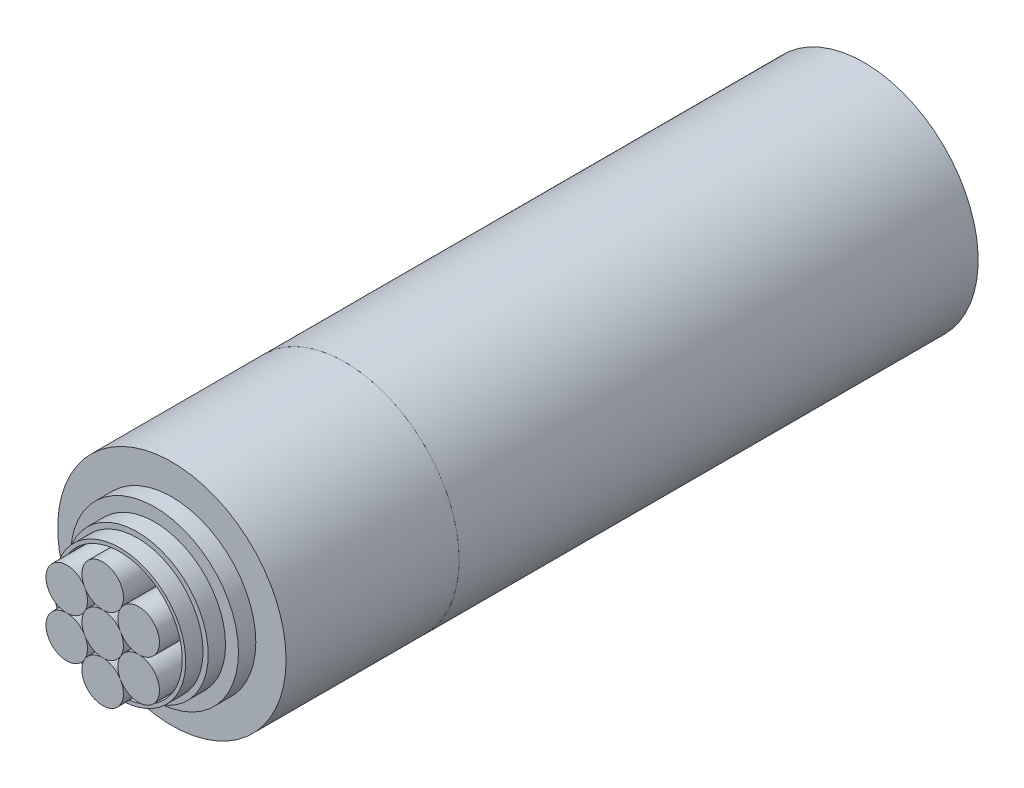
ISO-10303-21;
HEADER;
FILE_DESCRIPTION(('STEP AP214'),'2;1');
FILE_NAME('part.step','',(''),(''),'','','');
FILE_SCHEMA(('AUTOMOTIVE_DESIGN { 1 0 10303 214 1 1 1 1 }'));
ENDSEC;
DATA;
#1=APPLICATION_CONTEXT('core data for automotive mechanical design processes');
#2=APPLICATION_PROTOCOL_DEFINITION('international standard','automotive_design',2000,#1);
#3=PRODUCT_CONTEXT('',#1,'mechanical');
#4=PRODUCT('Part','Part','',(#3));
#5=PRODUCT_RELATED_PRODUCT_CATEGORY('part','',(#4));
#6=PRODUCT_DEFINITION_FORMATION('','',#4);
#7=PRODUCT_DEFINITION_CONTEXT('part definition',#1,'design');
#8=PRODUCT_DEFINITION('design','',#6,#7);
#9=PRODUCT_DEFINITION_SHAPE('','',#8);
#10=(LENGTH_UNIT() NAMED_UNIT(*) SI_UNIT(.MILLI.,.METRE.));
#11=(NAMED_UNIT(*) PLANE_ANGLE_UNIT() SI_UNIT($,.RADIAN.));
#12=(NAMED_UNIT(*) SI_UNIT($,.STERADIAN.) SOLID_ANGLE_UNIT());
#13=UNCERTAINTY_MEASURE_WITH_UNIT(LENGTH_MEASURE(1.E-05),#10,'distance_accuracy_value','');
#14=(GEOMETRIC_REPRESENTATION_CONTEXT(3) GLOBAL_UNCERTAINTY_ASSIGNED_CONTEXT((#13)) GLOBAL_UNIT_ASSIGNED_CONTEXT((#10,
#11,#12)) REPRESENTATION_CONTEXT('',''));
#15=CARTESIAN_POINT('',(0.,0.,0.));
#16=DIRECTION('',(0.,0.,1.));
#17=DIRECTION('',(1.,0.,0.));
#18=AXIS2_PLACEMENT_3D('',#15,#16,#17);
#19=CARTESIAN_POINT('',(0.,0.,-15.));
#20=DIRECTION('',(0.,0.,1.));
#21=DIRECTION('',(1.,0.,0.));
#22=AXIS2_PLACEMENT_3D('',#19,#20,#21);
#23=CYLINDRICAL_SURFACE('',#22,3.3);
#24=CARTESIAN_POINT('',(0.,0.,-15.));
#25=DIRECTION('',(0.,0.,-1.));
#26=DIRECTION('',(-1.,0.,0.));
#27=AXIS2_PLACEMENT_3D('',#24,#25,#26);
#28=CIRCLE('',#27,3.3);
#29=CARTESIAN_POINT('',(-3.3,0.,-15.));
#30=VERTEX_POINT('',#29);
#31=EDGE_CURVE('E12',#30,#30,#28,.T.);
#32=ORIENTED_EDGE('',*,*,#31,.F.);
#33=EDGE_LOOP('',(#32));
#34=FACE_BOUND('',#33,.T.);
#35=CARTESIAN_POINT('',(0.,0.,0.));
#36=DIRECTION('',(0.,0.,-1.));
#37=DIRECTION('',(-1.,0.,0.));
#38=AXIS2_PLACEMENT_3D('',#35,#36,#37);
#39=CIRCLE('',#38,3.3);
#40=CARTESIAN_POINT('',(-3.3,0.,0.));
#41=VERTEX_POINT('',#40);
#42=EDGE_CURVE('E125',#41,#41,#39,.T.);
#43=ORIENTED_EDGE('',*,*,#42,.T.);
#44=EDGE_LOOP('',(#43));
#45=FACE_BOUND('',#44,.T.);
#46=ADVANCED_FACE('F122',(#34,#45),#23,.T.);
#47=CARTESIAN_POINT('',(0.,0.,-15.));
#48=DIRECTION('',(0.,0.,-1.));
#49=DIRECTION('',(-1.,0.,0.));
#50=AXIS2_PLACEMENT_3D('',#47,#48,#49);
#51=PLANE('',#50);
#52=ORIENTED_EDGE('',*,*,#31,.T.);
#53=EDGE_LOOP('',(#52));
#54=FACE_BOUND('',#53,.T.);
#55=ADVANCED_FACE('F139',(#54),#51,.T.);
#56=CARTESIAN_POINT('',(0.,0.,0.));
#57=DIRECTION('',(0.,0.,-1.));
#58=DIRECTION('',(-1.,0.,0.));
#59=AXIS2_PLACEMENT_3D('',#56,#57,#58);
#60=PLANE('',#59);
#61=ORIENTED_EDGE('',*,*,#42,.F.);
#62=EDGE_LOOP('',(#61));
#63=FACE_BOUND('',#62,.T.);
#64=ADVANCED_FACE('F137',(#63),#60,.F.);
#65=CLOSED_SHELL('',(#46,#55,#64));
#66=MANIFOLD_SOLID_BREP('B2',#65);
#67=CARTESIAN_POINT('',(0.,0.,5.));
#68=DIRECTION('',(0.,0.,-1.));
#69=DIRECTION('',(-1.,0.,0.));
#70=AXIS2_PLACEMENT_3D('',#67,#68,#69);
#71=CYLINDRICAL_SURFACE('',#70,3.3);
#72=CARTESIAN_POINT('',(0.,0.,5.));
#73=DIRECTION('',(0.,0.,1.));
#74=DIRECTION('',(1.,0.,0.));
#75=AXIS2_PLACEMENT_3D('',#72,#73,#74);
#76=CIRCLE('',#75,3.3);
#77=CARTESIAN_POINT('',(3.3,0.,5.));
#78=VERTEX_POINT('',#77);
#79=EDGE_CURVE('E121',#78,#78,#76,.T.);
#80=ORIENTED_EDGE('',*,*,#79,.F.);
#81=EDGE_LOOP('',(#80));
#82=FACE_BOUND('',#81,.T.);
#83=CARTESIAN_POINT('',(0.,0.,0.));
#84=DIRECTION('',(0.,0.,1.));
#85=DIRECTION('',(1.,0.,0.));
#86=AXIS2_PLACEMENT_3D('',#83,#84,#85);
#87=CIRCLE('',#86,3.3);
#88=CARTESIAN_POINT('',(3.3,0.,0.));
#89=VERTEX_POINT('',#88);
#90=EDGE_CURVE('E175',#89,#89,#87,.T.);
#91=ORIENTED_EDGE('',*,*,#90,.T.);
#92=EDGE_LOOP('',(#91));
#93=FACE_BOUND('',#92,.T.);
#94=ADVANCED_FACE('F172',(#82,#93),#71,.T.);
#95=CARTESIAN_POINT('',(0.,0.,5.));
#96=DIRECTION('',(0.,0.,1.));
#97=DIRECTION('',(1.,0.,0.));
#98=AXIS2_PLACEMENT_3D('',#95,#96,#97);
#99=PLANE('',#98);
#100=CARTESIAN_POINT('',(0.,0.,5.));
#101=DIRECTION('',(0.,0.,1.));
#102=DIRECTION('',(1.,0.,0.));
#103=AXIS2_PLACEMENT_3D('',#100,#101,#102);
#104=CIRCLE('',#103,2.42499999999999);
#105=CARTESIAN_POINT('',(2.42499999999999,0.,5.));
#106=VERTEX_POINT('',#105);
#107=EDGE_CURVE('E179',#106,#106,#104,.T.);
#108=ORIENTED_EDGE('',*,*,#107,.F.);
#109=EDGE_LOOP('',(#108));
#110=FACE_BOUND('',#109,.T.);
#111=ORIENTED_EDGE('',*,*,#79,.T.);
#112=EDGE_LOOP('',(#111));
#113=FACE_BOUND('',#112,.T.);
#114=ADVANCED_FACE('F226',(#110,#113),#99,.T.);
#115=CARTESIAN_POINT('',(0.,0.,0.));
#116=DIRECTION('',(0.,0.,1.));
#117=DIRECTION('',(1.,0.,0.));
#118=AXIS2_PLACEMENT_3D('',#115,#116,#117);
#119=PLANE('',#118);
#120=ORIENTED_EDGE('',*,*,#90,.F.);
#121=EDGE_LOOP('',(#120));
#122=FACE_BOUND('',#121,.T.);
#123=CARTESIAN_POINT('',(0.,0.,0.));
#124=DIRECTION('',(0.,0.,1.));
#125=DIRECTION('',(1.,0.,0.));
#126=AXIS2_PLACEMENT_3D('',#123,#124,#125);
#127=CIRCLE('',#126,1.79999999999998);
#128=CARTESIAN_POINT('',(-1.79999999999998,0.,0.));
#129=VERTEX_POINT('',#128);
#130=EDGE_CURVE('E198',#129,#129,#127,.T.);
#131=ORIENTED_EDGE('',*,*,#130,.T.);
#132=EDGE_LOOP('',(#131));
#133=FACE_BOUND('',#132,.T.);
#134=ADVANCED_FACE('F231',(#122,#133),#119,.F.);
#135=CARTESIAN_POINT('',(0.,0.,5.5));
#136=DIRECTION('',(0.,0.,-1.));
#137=DIRECTION('',(-1.,0.,0.));
#138=AXIS2_PLACEMENT_3D('',#135,#136,#137);
#139=CYLINDRICAL_SURFACE('',#138,2.42499999999999);
#140=ORIENTED_EDGE('',*,*,#107,.T.);
#141=EDGE_LOOP('',(#140));
#142=FACE_BOUND('',#141,.T.);
#143=CARTESIAN_POINT('',(0.,0.,5.5));
#144=DIRECTION('',(0.,0.,1.));
#145=DIRECTION('',(1.,0.,0.));
#146=AXIS2_PLACEMENT_3D('',#143,#144,#145);
#147=CIRCLE('',#146,2.42499999999999);
#148=CARTESIAN_POINT('',(2.42499999999999,0.,5.5));
#149=VERTEX_POINT('',#148);
#150=EDGE_CURVE('E185',#149,#149,#147,.T.);
#151=ORIENTED_EDGE('',*,*,#150,.F.);
#152=EDGE_LOOP('',(#151));
#153=FACE_BOUND('',#152,.T.);
#154=ADVANCED_FACE('F240',(#142,#153),#139,.T.);
#155=CARTESIAN_POINT('',(0.,0.,5.5));
#156=DIRECTION('',(0.,0.,1.));
#157=DIRECTION('',(1.,0.,0.));
#158=AXIS2_PLACEMENT_3D('',#155,#156,#157);
#159=PLANE('',#158);
#160=CARTESIAN_POINT('',(0.,0.,5.5));
#161=DIRECTION('',(0.,0.,1.));
#162=DIRECTION('',(1.,0.,0.));
#163=AXIS2_PLACEMENT_3D('',#160,#161,#162);
#164=CIRCLE('',#163,2.04999999999999);
#165=CARTESIAN_POINT('',(2.04999999999999,0.,5.5));
#166=VERTEX_POINT('',#165);
#167=EDGE_CURVE('E188',#166,#166,#164,.T.);
#168=ORIENTED_EDGE('',*,*,#167,.F.);
#169=EDGE_LOOP('',(#168));
#170=FACE_BOUND('',#169,.T.);
#171=ORIENTED_EDGE('',*,*,#150,.T.);
#172=EDGE_LOOP('',(#171));
#173=FACE_BOUND('',#172,.T.);
#174=ADVANCED_FACE('F245',(#170,#173),#159,.T.);
#175=CARTESIAN_POINT('',(0.,0.,6.));
#176=DIRECTION('',(0.,0.,-1.));
#177=DIRECTION('',(-1.,0.,0.));
#178=AXIS2_PLACEMENT_3D('',#175,#176,#177);
#179=CYLINDRICAL_SURFACE('',#178,2.04999999999999);
#180=ORIENTED_EDGE('',*,*,#167,.T.);
#181=EDGE_LOOP('',(#180));
#182=FACE_BOUND('',#181,.T.);
#183=CARTESIAN_POINT('',(0.,0.,6.));
#184=DIRECTION('',(0.,0.,1.));
#185=DIRECTION('',(1.,0.,0.));
#186=AXIS2_PLACEMENT_3D('',#183,#184,#185);
#187=CIRCLE('',#186,2.04999999999999);
#188=CARTESIAN_POINT('',(2.04999999999999,0.,6.));
#189=VERTEX_POINT('',#188);
#190=EDGE_CURVE('E191',#189,#189,#187,.T.);
#191=ORIENTED_EDGE('',*,*,#190,.F.);
#192=EDGE_LOOP('',(#191));
#193=FACE_BOUND('',#192,.T.);
#194=ADVANCED_FACE('F251',(#182,#193),#179,.T.);
#195=CARTESIAN_POINT('',(0.,0.,6.));
#196=DIRECTION('',(0.,0.,1.));
#197=DIRECTION('',(1.,0.,0.));
#198=AXIS2_PLACEMENT_3D('',#195,#196,#197);
#199=PLANE('',#198);
#200=CARTESIAN_POINT('',(0.,0.,6.));
#201=DIRECTION('',(0.,0.,1.));
#202=DIRECTION('',(1.,0.,0.));
#203=AXIS2_PLACEMENT_3D('',#200,#201,#202);
#204=CIRCLE('',#203,1.89999999999999);
#205=CARTESIAN_POINT('',(-1.89999999999999,0.,6.));
#206=VERTEX_POINT('',#205);
#207=EDGE_CURVE('E194',#206,#206,#204,.T.);
#208=ORIENTED_EDGE('',*,*,#207,.F.);
#209=EDGE_LOOP('',(#208));
#210=FACE_BOUND('',#209,.T.);
#211=ORIENTED_EDGE('',*,*,#190,.T.);
#212=EDGE_LOOP('',(#211));
#213=FACE_BOUND('',#212,.T.);
#214=ADVANCED_FACE('F223',(#210,#213),#199,.T.);
#215=CARTESIAN_POINT('',(0.,0.,6.5));
#216=DIRECTION('',(0.,0.,-1.));
#217=DIRECTION('',(-1.,0.,0.));
#218=AXIS2_PLACEMENT_3D('',#215,#216,#217);
#219=CYLINDRICAL_SURFACE('',#218,1.79999999999998);
#220=CARTESIAN_POINT('',(0.,0.,6.5));
#221=DIRECTION('',(0.,0.,1.));
#222=DIRECTION('',(1.,0.,0.));
#223=AXIS2_PLACEMENT_3D('',#220,#221,#222);
#224=CIRCLE('',#223,1.79999999999998);
#225=CARTESIAN_POINT('',(-1.79999999999998,0.,6.5));
#226=VERTEX_POINT('',#225);
#227=EDGE_CURVE('E201',#226,#226,#224,.T.);
#228=CARTESIAN_POINT('',(-1.79999999999998,0.,6.5));
#229=CARTESIAN_POINT('',(-1.79999999999998,0.,6.43229166666667));
#230=CARTESIAN_POINT('',(-1.79999999999998,0.,6.36458333333333));
#231=CARTESIAN_POINT('',(-1.79999999999998,0.,6.22916666666667));
#232=CARTESIAN_POINT('',(-1.79999999999998,0.,6.16145833333333));
#233=CARTESIAN_POINT('',(-1.79999999999998,0.,6.02604166666667));
#234=CARTESIAN_POINT('',(-1.79999999999998,0.,5.95833333333333));
#235=CARTESIAN_POINT('',(-1.79999999999998,0.,5.82291666666667));
#236=CARTESIAN_POINT('',(-1.79999999999998,0.,5.75520833333333));
#237=CARTESIAN_POINT('',(-1.79999999999998,0.,5.61979166666667));
#238=CARTESIAN_POINT('',(-1.79999999999998,0.,5.55208333333333));
#239=CARTESIAN_POINT('',(-1.79999999999998,0.,5.41666666666667));
#240=CARTESIAN_POINT('',(-1.79999999999998,0.,5.34895833333333));
#241=CARTESIAN_POINT('',(-1.79999999999998,0.,5.21354166666667));
#242=CARTESIAN_POINT('',(-1.79999999999998,0.,5.14583333333333));
#243=CARTESIAN_POINT('',(-1.79999999999998,0.,5.01041666666667));
#244=CARTESIAN_POINT('',(-1.79999999999998,0.,4.94270833333333));
#245=CARTESIAN_POINT('',(-1.79999999999998,0.,4.80729166666667));
#246=CARTESIAN_POINT('',(-1.79999999999998,0.,4.73958333333333));
#247=CARTESIAN_POINT('',(-1.79999999999998,0.,4.60416666666667));
#248=CARTESIAN_POINT('',(-1.79999999999998,0.,4.53645833333333));
#249=CARTESIAN_POINT('',(-1.79999999999998,0.,4.40104166666667));
#250=CARTESIAN_POINT('',(-1.79999999999998,0.,4.33333333333333));
#251=CARTESIAN_POINT('',(-1.79999999999998,0.,4.19791666666667));
#252=CARTESIAN_POINT('',(-1.79999999999998,0.,4.13020833333333));
#253=CARTESIAN_POINT('',(-1.79999999999998,0.,3.99479166666667));
#254=CARTESIAN_POINT('',(-1.79999999999998,0.,3.92708333333333));
#255=CARTESIAN_POINT('',(-1.79999999999998,0.,3.79166666666667));
#256=CARTESIAN_POINT('',(-1.79999999999998,0.,3.72395833333333));
#257=CARTESIAN_POINT('',(-1.79999999999998,0.,3.58854166666667));
#258=CARTESIAN_POINT('',(-1.79999999999998,0.,3.52083333333333));
#259=CARTESIAN_POINT('',(-1.79999999999998,0.,3.38541666666667));
#260=CARTESIAN_POINT('',(-1.79999999999998,0.,3.31770833333333));
#261=CARTESIAN_POINT('',(-1.79999999999998,0.,3.18229166666667));
#262=CARTESIAN_POINT('',(-1.79999999999998,0.,3.11458333333333));
#263=CARTESIAN_POINT('',(-1.79999999999998,0.,2.97916666666667));
#264=CARTESIAN_POINT('',(-1.79999999999998,0.,2.91145833333333));
#265=CARTESIAN_POINT('',(-1.79999999999998,0.,2.77604166666667));
#266=CARTESIAN_POINT('',(-1.79999999999998,0.,2.70833333333333));
#267=CARTESIAN_POINT('',(-1.79999999999998,0.,2.57291666666667));
#268=CARTESIAN_POINT('',(-1.79999999999998,0.,2.50520833333333));
#269=CARTESIAN_POINT('',(-1.79999999999998,0.,2.36979166666667));
#270=CARTESIAN_POINT('',(-1.79999999999998,0.,2.30208333333333));
#271=CARTESIAN_POINT('',(-1.79999999999998,0.,2.16666666666667));
#272=CARTESIAN_POINT('',(-1.79999999999998,0.,2.09895833333333));
#273=CARTESIAN_POINT('',(-1.79999999999998,0.,1.96354166666667));
#274=CARTESIAN_POINT('',(-1.79999999999998,0.,1.89583333333333));
#275=CARTESIAN_POINT('',(-1.79999999999998,0.,1.76041666666667));
#276=CARTESIAN_POINT('',(-1.79999999999998,0.,1.69270833333333));
#277=CARTESIAN_POINT('',(-1.79999999999998,0.,1.55729166666667));
#278=CARTESIAN_POINT('',(-1.79999999999998,0.,1.48958333333333));
#279=CARTESIAN_POINT('',(-1.79999999999998,0.,1.35416666666667));
#280=CARTESIAN_POINT('',(-1.79999999999998,0.,1.28645833333333));
#281=CARTESIAN_POINT('',(-1.79999999999998,0.,1.15104166666667));
#282=CARTESIAN_POINT('',(-1.79999999999998,0.,1.08333333333333));
#283=CARTESIAN_POINT('',(-1.79999999999998,0.,0.947916666666667));
#284=CARTESIAN_POINT('',(-1.79999999999998,0.,0.880208333333333));
#285=CARTESIAN_POINT('',(-1.79999999999998,0.,0.744791666666667));
#286=CARTESIAN_POINT('',(-1.79999999999998,0.,0.677083333333333));
#287=CARTESIAN_POINT('',(-1.79999999999998,0.,0.541666666666667));
#288=CARTESIAN_POINT('',(-1.79999999999998,0.,0.473958333333333));
#289=CARTESIAN_POINT('',(-1.79999999999998,0.,0.338541666666667));
#290=CARTESIAN_POINT('',(-1.79999999999998,0.,0.270833333333334));
#291=CARTESIAN_POINT('',(-1.79999999999998,0.,0.135416666666667));
#292=CARTESIAN_POINT('',(-1.79999999999998,0.,0.0677083333333334));
#293=CARTESIAN_POINT('',(-1.79999999999998,0.,0.));
#294=B_SPLINE_CURVE_WITH_KNOTS('',3,(#228,#229,#230,#231,#232,#233,#234,#235,#236,#237,#238,
#239,#240,#241,#242,#243,#244,#245,#246,#247,#248,#249,#250,#251,#252,#253,#254,#255,#256,#257,
#258,#259,#260,#261,#262,#263,#264,#265,#266,#267,#268,#269,#270,#271,#272,#273,#274,#275,#276,
#277,#278,#279,#280,#281,#282,#283,#284,#285,#286,#287,#288,#289,#290,#291,#292,#293),
.UNSPECIFIED.,.F.,.F.,(4,2,2,2,2,2,2,2,2,2,2,2,2,2,2,2,2,2,2,2,2,2,2,2,2,2,2,2,2,2,2,2,4),(0.,
0.203124999999999,0.40625,0.609375,0.812499999999999,1.015625,1.21875,1.421875,1.625,1.828125,
2.03125,2.234375,2.4375,2.640625,2.84375,3.046875,3.25,3.453125,3.65625,3.859375,4.0625,
4.265625,4.46875,4.671875,4.875,5.078125,5.28125,5.484375,5.6875,5.890625,6.09375,6.296875,6.5),.UNSPECIFIED.);
#295=EDGE_CURVE('BSEAM207',#226,#129,#294,.T.);
#296=ORIENTED_EDGE('',*,*,#227,.T.);
#297=ORIENTED_EDGE('',*,*,#130,.F.);
#298=ORIENTED_EDGE('',*,*,#295,.T.);
#299=ORIENTED_EDGE('',*,*,#295,.F.);
#300=EDGE_LOOP('',(#296,#298,#297,#299));
#301=FACE_BOUND('',#300,.T.);
#302=ADVANCED_FACE('F207',(#301),#219,.F.);
#303=CARTESIAN_POINT('',(0.,0.,6.5));
#304=DIRECTION('',(0.,0.,-1.));
#305=DIRECTION('',(-1.,0.,0.));
#306=AXIS2_PLACEMENT_3D('',#303,#304,#305);
#307=CYLINDRICAL_SURFACE('',#306,1.89999999999999);
#308=CARTESIAN_POINT('',(0.,0.,6.5));
#309=DIRECTION('',(0.,0.,1.));
#310=DIRECTION('',(1.,0.,0.));
#311=AXIS2_PLACEMENT_3D('',#308,#309,#310);
#312=CIRCLE('',#311,1.89999999999999);
#313=CARTESIAN_POINT('',(-1.89999999999999,0.,6.5));
#314=VERTEX_POINT('',#313);
#315=EDGE_CURVE('E197',#314,#314,#312,.T.);
#316=CARTESIAN_POINT('',(-1.89999999999999,0.,6.));
#317=CARTESIAN_POINT('',(-1.89999999999999,0.,6.00520833333333));
#318=CARTESIAN_POINT('',(-1.89999999999999,0.,6.01041666666667));
#319=CARTESIAN_POINT('',(-1.89999999999999,0.,6.02083333333333));
#320=CARTESIAN_POINT('',(-1.89999999999999,0.,6.02604166666667));
#321=CARTESIAN_POINT('',(-1.89999999999999,0.,6.03645833333333));
#322=CARTESIAN_POINT('',(-1.89999999999999,0.,6.04166666666667));
#323=CARTESIAN_POINT('',(-1.89999999999999,0.,6.05208333333333));
#324=CARTESIAN_POINT('',(-1.89999999999999,0.,6.05729166666667));
#325=CARTESIAN_POINT('',(-1.89999999999999,0.,6.06770833333333));
#326=CARTESIAN_POINT('',(-1.89999999999999,0.,6.07291666666667));
#327=CARTESIAN_POINT('',(-1.89999999999999,0.,6.08333333333333));
#328=CARTESIAN_POINT('',(-1.89999999999999,0.,6.08854166666667));
#329=CARTESIAN_POINT('',(-1.89999999999999,0.,6.09895833333333));
#330=CARTESIAN_POINT('',(-1.89999999999999,0.,6.10416666666667));
#331=CARTESIAN_POINT('',(-1.89999999999999,0.,6.11458333333333));
#332=CARTESIAN_POINT('',(-1.89999999999999,0.,6.11979166666667));
#333=CARTESIAN_POINT('',(-1.89999999999999,0.,6.13020833333333));
#334=CARTESIAN_POINT('',(-1.89999999999999,0.,6.13541666666667));
#335=CARTESIAN_POINT('',(-1.89999999999999,0.,6.14583333333333));
#336=CARTESIAN_POINT('',(-1.89999999999999,0.,6.15104166666667));
#337=CARTESIAN_POINT('',(-1.89999999999999,0.,6.16145833333333));
#338=CARTESIAN_POINT('',(-1.89999999999999,0.,6.16666666666667));
#339=CARTESIAN_POINT('',(-1.89999999999999,0.,6.17708333333333));
#340=CARTESIAN_POINT('',(-1.89999999999999,0.,6.18229166666667));
#341=CARTESIAN_POINT('',(-1.89999999999999,0.,6.19270833333333));
#342=CARTESIAN_POINT('',(-1.89999999999999,0.,6.19791666666667));
#343=CARTESIAN_POINT('',(-1.89999999999999,0.,6.20833333333333));
#344=CARTESIAN_POINT('',(-1.89999999999999,0.,6.21354166666667));
#345=CARTESIAN_POINT('',(-1.89999999999999,0.,6.22395833333333));
#346=CARTESIAN_POINT('',(-1.89999999999999,0.,6.22916666666667));
#347=CARTESIAN_POINT('',(-1.89999999999999,0.,6.23958333333333));
#348=CARTESIAN_POINT('',(-1.89999999999999,0.,6.24479166666667));
#349=CARTESIAN_POINT('',(-1.89999999999999,0.,6.25520833333333));
#350=CARTESIAN_POINT('',(-1.89999999999999,0.,6.26041666666667));
#351=CARTESIAN_POINT('',(-1.89999999999999,0.,6.27083333333333));
#352=CARTESIAN_POINT('',(-1.89999999999999,0.,6.27604166666667));
#353=CARTESIAN_POINT('',(-1.89999999999999,0.,6.28645833333333));
#354=CARTESIAN_POINT('',(-1.89999999999999,0.,6.29166666666667));
#355=CARTESIAN_POINT('',(-1.89999999999999,0.,6.30208333333333));
#356=CARTESIAN_POINT('',(-1.89999999999999,0.,6.30729166666667));
#357=CARTESIAN_POINT('',(-1.89999999999999,0.,6.31770833333333));
#358=CARTESIAN_POINT('',(-1.89999999999999,0.,6.32291666666667));
#359=CARTESIAN_POINT('',(-1.89999999999999,0.,6.33333333333333));
#360=CARTESIAN_POINT('',(-1.89999999999999,0.,6.33854166666667));
#361=CARTESIAN_POINT('',(-1.89999999999999,0.,6.34895833333333));
#362=CARTESIAN_POINT('',(-1.89999999999999,0.,6.35416666666667));
#363=CARTESIAN_POINT('',(-1.89999999999999,0.,6.36458333333333));
#364=CARTESIAN_POINT('',(-1.89999999999999,0.,6.36979166666667));
#365=CARTESIAN_POINT('',(-1.89999999999999,0.,6.38020833333333));
#366=CARTESIAN_POINT('',(-1.89999999999999,0.,6.38541666666667));
#367=CARTESIAN_POINT('',(-1.89999999999999,0.,6.39583333333333));
#368=CARTESIAN_POINT('',(-1.89999999999999,0.,6.40104166666667));
#369=CARTESIAN_POINT('',(-1.89999999999999,0.,6.41145833333333));
#370=CARTESIAN_POINT('',(-1.89999999999999,0.,6.41666666666667));
#371=CARTESIAN_POINT('',(-1.89999999999999,0.,6.42708333333333));
#372=CARTESIAN_POINT('',(-1.89999999999999,0.,6.43229166666667));
#373=CARTESIAN_POINT('',(-1.89999999999999,0.,6.44270833333333));
#374=CARTESIAN_POINT('',(-1.89999999999999,0.,6.44791666666667));
#375=CARTESIAN_POINT('',(-1.89999999999999,0.,6.45833333333333));
#376=CARTESIAN_POINT('',(-1.89999999999999,0.,6.46354166666667));
#377=CARTESIAN_POINT('',(-1.89999999999999,0.,6.47395833333333));
#378=CARTESIAN_POINT('',(-1.89999999999999,0.,6.47916666666667));
#379=CARTESIAN_POINT('',(-1.89999999999999,0.,6.48958333333333));
#380=CARTESIAN_POINT('',(-1.89999999999999,0.,6.49479166666667));
#381=CARTESIAN_POINT('',(-1.89999999999999,0.,6.5));
#382=B_SPLINE_CURVE_WITH_KNOTS('',3,(#316,#317,#318,#319,#320,#321,#322,#323,#324,#325,#326,
#327,#328,#329,#330,#331,#332,#333,#334,#335,#336,#337,#338,#339,#340,#341,#342,#343,#344,#345,
#346,#347,#348,#349,#350,#351,#352,#353,#354,#355,#356,#357,#358,#359,#360,#361,#362,#363,#364,
#365,#366,#367,#368,#369,#370,#371,#372,#373,#374,#375,#376,#377,#378,#379,#380,#381),
.UNSPECIFIED.,.F.,.F.,(4,2,2,2,2,2,2,2,2,2,2,2,2,2,2,2,2,2,2,2,2,2,2,2,2,2,2,2,2,2,2,2,4),(0.,
0.015625,0.03125,0.046875,0.0625000000000001,0.0781250000000001,0.0937500000000001,0.109375,
0.125,0.140625,0.15625,0.171875,0.1875,0.203125,0.21875,0.234375,0.25,0.265625,0.28125,0.296875,
0.3125,0.328125,0.34375,0.359375,0.375,0.390625,0.40625,0.421875,0.4375,0.453125,0.46875,
0.484375,0.5),.UNSPECIFIED.);
#383=EDGE_CURVE('BSEAM213',#206,#314,#382,.T.);
#384=ORIENTED_EDGE('',*,*,#207,.T.);
#385=ORIENTED_EDGE('',*,*,#315,.F.);
#386=ORIENTED_EDGE('',*,*,#383,.T.);
#387=ORIENTED_EDGE('',*,*,#383,.F.);
#388=EDGE_LOOP('',(#384,#386,#385,#387));
#389=FACE_BOUND('',#388,.T.);
#390=ADVANCED_FACE('F213',(#389),#307,.T.);
#391=CARTESIAN_POINT('',(0.,0.,6.5));
#392=DIRECTION('',(0.,0.,1.));
#393=DIRECTION('',(1.,0.,0.));
#394=AXIS2_PLACEMENT_3D('',#391,#392,#393);
#395=PLANE('',#394);
#396=ORIENTED_EDGE('',*,*,#227,.F.);
#397=EDGE_LOOP('',(#396));
#398=FACE_BOUND('',#397,.T.);
#399=ORIENTED_EDGE('',*,*,#315,.T.);
#400=EDGE_LOOP('',(#399));
#401=FACE_BOUND('',#400,.T.);
#402=ADVANCED_FACE('F210',(#398,#401),#395,.T.);
#403=CLOSED_SHELL('',(#94,#114,#134,#154,#174,#194,#214,#302,#390,#402));
#404=MANIFOLD_SOLID_BREP('B7',#403);
#405=CARTESIAN_POINT('',(0.,1.2,7.));
#406=DIRECTION('',(0.,0.,-1.));
#407=DIRECTION('',(-1.,0.,0.));
#408=AXIS2_PLACEMENT_3D('',#405,#406,#407);
#409=CYLINDRICAL_SURFACE('',#408,0.6);
#410=CARTESIAN_POINT('',(0.,1.2,7.));
#411=DIRECTION('',(0.,0.,1.));
#412=DIRECTION('',(1.,0.,0.));
#413=AXIS2_PLACEMENT_3D('',#410,#411,#412);
#414=CIRCLE('',#413,0.6);
#415=CARTESIAN_POINT('',(0.6,1.2,7.));
#416=VERTEX_POINT('',#415);
#417=EDGE_CURVE('E171',#416,#416,#414,.T.);
#418=ORIENTED_EDGE('',*,*,#417,.F.);
#419=EDGE_LOOP('',(#418));
#420=FACE_BOUND('',#419,.T.);
#421=CARTESIAN_POINT('',(0.,1.2,0.));
#422=DIRECTION('',(0.,0.,1.));
#423=DIRECTION('',(1.,0.,0.));
#424=AXIS2_PLACEMENT_3D('',#421,#422,#423);
#425=CIRCLE('',#424,0.6);
#426=CARTESIAN_POINT('',(0.6,1.2,0.));
#427=VERTEX_POINT('',#426);
#428=EDGE_CURVE('E359',#427,#427,#425,.T.);
#429=ORIENTED_EDGE('',*,*,#428,.T.);
#430=EDGE_LOOP('',(#429));
#431=FACE_BOUND('',#430,.T.);
#432=ADVANCED_FACE('F356',(#420,#431),#409,.T.);
#433=CARTESIAN_POINT('',(0.,0.,7.));
#434=DIRECTION('',(0.,0.,1.));
#435=DIRECTION('',(1.,0.,0.));
#436=AXIS2_PLACEMENT_3D('',#433,#434,#435);
#437=PLANE('',#436);
#438=ORIENTED_EDGE('',*,*,#417,.T.);
#439=EDGE_LOOP('',(#438));
#440=FACE_BOUND('',#439,.T.);
#441=ADVANCED_FACE('F371',(#440),#437,.T.);
#442=CARTESIAN_POINT('',(0.,0.,0.));
#443=DIRECTION('',(0.,0.,1.));
#444=DIRECTION('',(1.,0.,0.));
#445=AXIS2_PLACEMENT_3D('',#442,#443,#444);
#446=PLANE('',#445);
#447=ORIENTED_EDGE('',*,*,#428,.F.);
#448=EDGE_LOOP('',(#447));
#449=FACE_BOUND('',#448,.T.);
#450=ADVANCED_FACE('F369',(#449),#446,.F.);
#451=CLOSED_SHELL('',(#432,#441,#450));
#452=MANIFOLD_SOLID_BREP('B116',#451);
#453=CARTESIAN_POINT('',(1.03923048454131,0.6,7.));
#454=DIRECTION('',(0.,0.,-1.));
#455=DIRECTION('',(-1.,0.,0.));
#456=AXIS2_PLACEMENT_3D('',#453,#454,#455);
#457=CYLINDRICAL_SURFACE('',#456,0.600000000000014);
#458=CARTESIAN_POINT('',(1.03923048454131,0.6,7.));
#459=DIRECTION('',(0.,0.,1.));
#460=DIRECTION('',(1.,0.,0.));
#461=AXIS2_PLACEMENT_3D('',#458,#459,#460);
#462=CIRCLE('',#461,0.600000000000014);
#463=CARTESIAN_POINT('',(1.63923048454133,0.6,7.));
#464=VERTEX_POINT('',#463);
#465=EDGE_CURVE('E355',#464,#464,#462,.T.);
#466=ORIENTED_EDGE('',*,*,#465,.F.);
#467=EDGE_LOOP('',(#466));
#468=FACE_BOUND('',#467,.T.);
#469=CARTESIAN_POINT('',(1.03923048454131,0.6,0.));
#470=DIRECTION('',(0.,0.,1.));
#471=DIRECTION('',(1.,0.,0.));
#472=AXIS2_PLACEMENT_3D('',#469,#470,#471);
#473=CIRCLE('',#472,0.600000000000014);
#474=CARTESIAN_POINT('',(1.63923048454133,0.6,0.));
#475=VERTEX_POINT('',#474);
#476=EDGE_CURVE('E411',#475,#475,#473,.T.);
#477=ORIENTED_EDGE('',*,*,#476,.T.);
#478=EDGE_LOOP('',(#477));
#479=FACE_BOUND('',#478,.T.);
#480=ADVANCED_FACE('F408',(#468,#479),#457,.T.);
#481=CARTESIAN_POINT('',(0.,0.,7.));
#482=DIRECTION('',(0.,0.,1.));
#483=DIRECTION('',(1.,0.,0.));
#484=AXIS2_PLACEMENT_3D('',#481,#482,#483);
#485=PLANE('',#484);
#486=ORIENTED_EDGE('',*,*,#465,.T.);
#487=EDGE_LOOP('',(#486));
#488=FACE_BOUND('',#487,.T.);
#489=ADVANCED_FACE('F423',(#488),#485,.T.);
#490=CARTESIAN_POINT('',(0.,0.,0.));
#491=DIRECTION('',(0.,0.,1.));
#492=DIRECTION('',(1.,0.,0.));
#493=AXIS2_PLACEMENT_3D('',#490,#491,#492);
#494=PLANE('',#493);
#495=ORIENTED_EDGE('',*,*,#476,.F.);
#496=EDGE_LOOP('',(#495));
#497=FACE_BOUND('',#496,.T.);
#498=ADVANCED_FACE('F421',(#497),#494,.F.);
#499=CLOSED_SHELL('',(#480,#489,#498));
#500=MANIFOLD_SOLID_BREP('B166',#499);
#501=CARTESIAN_POINT('',(0.,0.,7.));
#502=DIRECTION('',(0.,0.,-1.));
#503=DIRECTION('',(-1.,0.,0.));
#504=AXIS2_PLACEMENT_3D('',#501,#502,#503);
#505=CYLINDRICAL_SURFACE('',#504,0.6);
#506=CARTESIAN_POINT('',(0.,0.,7.));
#507=DIRECTION('',(0.,0.,1.));
#508=DIRECTION('',(1.,0.,0.));
#509=AXIS2_PLACEMENT_3D('',#506,#507,#508);
#510=CIRCLE('',#509,0.6);
#511=CARTESIAN_POINT('',(0.6,0.,7.));
#512=VERTEX_POINT('',#511);
#513=EDGE_CURVE('E407',#512,#512,#510,.T.);
#514=ORIENTED_EDGE('',*,*,#513,.F.);
#515=EDGE_LOOP('',(#514));
#516=FACE_BOUND('',#515,.T.);
#517=CARTESIAN_POINT('',(0.,0.,0.));
#518=DIRECTION('',(0.,0.,1.));
#519=DIRECTION('',(1.,0.,0.));
#520=AXIS2_PLACEMENT_3D('',#517,#518,#519);
#521=CIRCLE('',#520,0.6);
#522=CARTESIAN_POINT('',(0.6,0.,0.));
#523=VERTEX_POINT('',#522);
#524=EDGE_CURVE('E463',#523,#523,#521,.T.);
#525=ORIENTED_EDGE('',*,*,#524,.T.);
#526=EDGE_LOOP('',(#525));
#527=FACE_BOUND('',#526,.T.);
#528=ADVANCED_FACE('F460',(#516,#527),#505,.T.);
#529=CARTESIAN_POINT('',(0.,0.,7.));
#530=DIRECTION('',(0.,0.,1.));
#531=DIRECTION('',(1.,0.,0.));
#532=AXIS2_PLACEMENT_3D('',#529,#530,#531);
#533=PLANE('',#532);
#534=ORIENTED_EDGE('',*,*,#513,.T.);
#535=EDGE_LOOP('',(#534));
#536=FACE_BOUND('',#535,.T.);
#537=ADVANCED_FACE('F475',(#536),#533,.T.);
#538=CARTESIAN_POINT('',(0.,0.,0.));
#539=DIRECTION('',(0.,0.,1.));
#540=DIRECTION('',(1.,0.,0.));
#541=AXIS2_PLACEMENT_3D('',#538,#539,#540);
#542=PLANE('',#541);
#543=ORIENTED_EDGE('',*,*,#524,.F.);
#544=EDGE_LOOP('',(#543));
#545=FACE_BOUND('',#544,.T.);
#546=ADVANCED_FACE('F473',(#545),#542,.F.);
#547=CLOSED_SHELL('',(#528,#537,#546));
#548=MANIFOLD_SOLID_BREP('B350',#547);
#549=CARTESIAN_POINT('',(-1.03923048454132,0.600000000000012,7.));
#550=DIRECTION('',(0.,0.,-1.));
#551=DIRECTION('',(-1.,0.,0.));
#552=AXIS2_PLACEMENT_3D('',#549,#550,#551);
#553=CYLINDRICAL_SURFACE('',#552,0.6);
#554=CARTESIAN_POINT('',(-1.03923048454132,0.600000000000012,7.));
#555=DIRECTION('',(0.,0.,1.));
#556=DIRECTION('',(1.,0.,0.));
#557=AXIS2_PLACEMENT_3D('',#554,#555,#556);
#558=CIRCLE('',#557,0.6);
#559=CARTESIAN_POINT('',(-0.439230484541319,0.600000000000012,7.));
#560=VERTEX_POINT('',#559);
#561=EDGE_CURVE('E459',#560,#560,#558,.T.);
#562=ORIENTED_EDGE('',*,*,#561,.F.);
#563=EDGE_LOOP('',(#562));
#564=FACE_BOUND('',#563,.T.);
#565=CARTESIAN_POINT('',(-1.03923048454132,0.600000000000012,0.));
#566=DIRECTION('',(0.,0.,1.));
#567=DIRECTION('',(1.,0.,0.));
#568=AXIS2_PLACEMENT_3D('',#565,#566,#567);
#569=CIRCLE('',#568,0.6);
#570=CARTESIAN_POINT('',(-0.439230484541319,0.600000000000012,0.));
#571=VERTEX_POINT('',#570);
#572=EDGE_CURVE('E515',#571,#571,#569,.T.);
#573=ORIENTED_EDGE('',*,*,#572,.T.);
#574=EDGE_LOOP('',(#573));
#575=FACE_BOUND('',#574,.T.);
#576=ADVANCED_FACE('F512',(#564,#575),#553,.T.);
#577=CARTESIAN_POINT('',(0.,0.,7.));
#578=DIRECTION('',(0.,0.,1.));
#579=DIRECTION('',(1.,0.,0.));
#580=AXIS2_PLACEMENT_3D('',#577,#578,#579);
#581=PLANE('',#580);
#582=ORIENTED_EDGE('',*,*,#561,.T.);
#583=EDGE_LOOP('',(#582));
#584=FACE_BOUND('',#583,.T.);
#585=ADVANCED_FACE('F527',(#584),#581,.T.);
#586=CARTESIAN_POINT('',(0.,0.,0.));
#587=DIRECTION('',(0.,0.,1.));
#588=DIRECTION('',(1.,0.,0.));
#589=AXIS2_PLACEMENT_3D('',#586,#587,#588);
#590=PLANE('',#589);
#591=ORIENTED_EDGE('',*,*,#572,.F.);
#592=EDGE_LOOP('',(#591));
#593=FACE_BOUND('',#592,.T.);
#594=ADVANCED_FACE('F525',(#593),#590,.F.);
#595=CLOSED_SHELL('',(#576,#585,#594));
#596=MANIFOLD_SOLID_BREP('B402',#595);
#597=CARTESIAN_POINT('',(-1.03923048454133,-0.599999999999975,7.));
#598=DIRECTION('',(0.,0.,-1.));
#599=DIRECTION('',(-1.,0.,0.));
#600=AXIS2_PLACEMENT_3D('',#597,#598,#599);
#601=CYLINDRICAL_SURFACE('',#600,0.599999999999994);
#602=CARTESIAN_POINT('',(-1.03923048454133,-0.599999999999975,7.));
#603=DIRECTION('',(0.,0.,1.));
#604=DIRECTION('',(1.,0.,0.));
#605=AXIS2_PLACEMENT_3D('',#602,#603,#604);
#606=CIRCLE('',#605,0.599999999999994);
#607=CARTESIAN_POINT('',(-0.439230484541333,-0.599999999999975,7.));
#608=VERTEX_POINT('',#607);
#609=EDGE_CURVE('E511',#608,#608,#606,.T.);
#610=ORIENTED_EDGE('',*,*,#609,.F.);
#611=EDGE_LOOP('',(#610));
#612=FACE_BOUND('',#611,.T.);
#613=CARTESIAN_POINT('',(-1.03923048454133,-0.599999999999975,0.));
#614=DIRECTION('',(0.,0.,1.));
#615=DIRECTION('',(1.,0.,0.));
#616=AXIS2_PLACEMENT_3D('',#613,#614,#615);
#617=CIRCLE('',#616,0.599999999999994);
#618=CARTESIAN_POINT('',(-0.439230484541333,-0.599999999999975,0.));
#619=VERTEX_POINT('',#618);
#620=EDGE_CURVE('E567',#619,#619,#617,.T.);
#621=ORIENTED_EDGE('',*,*,#620,.T.);
#622=EDGE_LOOP('',(#621));
#623=FACE_BOUND('',#622,.T.);
#624=ADVANCED_FACE('F564',(#612,#623),#601,.T.);
#625=CARTESIAN_POINT('',(0.,0.,7.));
#626=DIRECTION('',(0.,0.,1.));
#627=DIRECTION('',(1.,0.,0.));
#628=AXIS2_PLACEMENT_3D('',#625,#626,#627);
#629=PLANE('',#628);
#630=ORIENTED_EDGE('',*,*,#609,.T.);
#631=EDGE_LOOP('',(#630));
#632=FACE_BOUND('',#631,.T.);
#633=ADVANCED_FACE('F579',(#632),#629,.T.);
#634=CARTESIAN_POINT('',(0.,0.,0.));
#635=DIRECTION('',(0.,0.,1.));
#636=DIRECTION('',(1.,0.,0.));
#637=AXIS2_PLACEMENT_3D('',#634,#635,#636);
#638=PLANE('',#637);
#639=ORIENTED_EDGE('',*,*,#620,.F.);
#640=EDGE_LOOP('',(#639));
#641=FACE_BOUND('',#640,.T.);
#642=ADVANCED_FACE('F577',(#641),#638,.F.);
#643=CLOSED_SHELL('',(#624,#633,#642));
#644=MANIFOLD_SOLID_BREP('B454',#643);
#645=CARTESIAN_POINT('',(0.,-1.19999999999997,7.));
#646=DIRECTION('',(0.,0.,-1.));
#647=DIRECTION('',(-1.,0.,0.));
#648=AXIS2_PLACEMENT_3D('',#645,#646,#647);
#649=CYLINDRICAL_SURFACE('',#648,0.600000000000001);
#650=CARTESIAN_POINT('',(0.,-1.19999999999997,7.));
#651=DIRECTION('',(0.,0.,1.));
#652=DIRECTION('',(1.,0.,0.));
#653=AXIS2_PLACEMENT_3D('',#650,#651,#652);
#654=CIRCLE('',#653,0.600000000000001);
#655=CARTESIAN_POINT('',(0.599999999999987,-1.19999999999997,7.));
#656=VERTEX_POINT('',#655);
#657=EDGE_CURVE('E563',#656,#656,#654,.T.);
#658=ORIENTED_EDGE('',*,*,#657,.F.);
#659=EDGE_LOOP('',(#658));
#660=FACE_BOUND('',#659,.T.);
#661=CARTESIAN_POINT('',(0.,-1.19999999999997,0.));
#662=DIRECTION('',(0.,0.,1.));
#663=DIRECTION('',(1.,0.,0.));
#664=AXIS2_PLACEMENT_3D('',#661,#662,#663);
#665=CIRCLE('',#664,0.600000000000001);
#666=CARTESIAN_POINT('',(0.599999999999987,-1.19999999999997,0.));
#667=VERTEX_POINT('',#666);
#668=EDGE_CURVE('E618',#667,#667,#665,.T.);
#669=ORIENTED_EDGE('',*,*,#668,.T.);
#670=EDGE_LOOP('',(#669));
#671=FACE_BOUND('',#670,.T.);
#672=ADVANCED_FACE('F615',(#660,#671),#649,.T.);
#673=CARTESIAN_POINT('',(0.,0.,7.));
#674=DIRECTION('',(0.,0.,1.));
#675=DIRECTION('',(1.,0.,0.));
#676=AXIS2_PLACEMENT_3D('',#673,#674,#675);
#677=PLANE('',#676);
#678=ORIENTED_EDGE('',*,*,#657,.T.);
#679=EDGE_LOOP('',(#678));
#680=FACE_BOUND('',#679,.T.);
#681=ADVANCED_FACE('F630',(#680),#677,.T.);
#682=CARTESIAN_POINT('',(0.,0.,0.));
#683=DIRECTION('',(0.,0.,1.));
#684=DIRECTION('',(1.,0.,0.));
#685=AXIS2_PLACEMENT_3D('',#682,#683,#684);
#686=PLANE('',#685);
#687=ORIENTED_EDGE('',*,*,#668,.F.);
#688=EDGE_LOOP('',(#687));
#689=FACE_BOUND('',#688,.T.);
#690=ADVANCED_FACE('F628',(#689),#686,.F.);
#691=CLOSED_SHELL('',(#672,#681,#690));
#692=MANIFOLD_SOLID_BREP('B506',#691);
#693=CARTESIAN_POINT('',(1.0392304845413,-0.599999999999987,7.));
#694=DIRECTION('',(0.,0.,-1.));
#695=DIRECTION('',(-1.,0.,0.));
#696=AXIS2_PLACEMENT_3D('',#693,#694,#695);
#697=CYLINDRICAL_SURFACE('',#696,0.600000000000013);
#698=CARTESIAN_POINT('',(1.0392304845413,-0.599999999999987,7.));
#699=DIRECTION('',(0.,0.,1.));
#700=DIRECTION('',(1.,0.,0.));
#701=AXIS2_PLACEMENT_3D('',#698,#699,#700);
#702=CIRCLE('',#701,0.600000000000013);
#703=CARTESIAN_POINT('',(1.63923048454132,-0.599999999999987,7.));
#704=VERTEX_POINT('',#703);
#705=EDGE_CURVE('E614',#704,#704,#702,.T.);
#706=ORIENTED_EDGE('',*,*,#705,.F.);
#707=EDGE_LOOP('',(#706));
#708=FACE_BOUND('',#707,.T.);
#709=CARTESIAN_POINT('',(1.0392304845413,-0.599999999999987,0.));
#710=DIRECTION('',(0.,0.,1.));
#711=DIRECTION('',(1.,0.,0.));
#712=AXIS2_PLACEMENT_3D('',#709,#710,#711);
#713=CIRCLE('',#712,0.600000000000013);
#714=CARTESIAN_POINT('',(1.63923048454132,-0.599999999999987,0.));
#715=VERTEX_POINT('',#714);
#716=EDGE_CURVE('E662',#715,#715,#713,.T.);
#717=ORIENTED_EDGE('',*,*,#716,.T.);
#718=EDGE_LOOP('',(#717));
#719=FACE_BOUND('',#718,.T.);
#720=ADVANCED_FACE('F659',(#708,#719),#697,.T.);
#721=CARTESIAN_POINT('',(0.,0.,7.));
#722=DIRECTION('',(0.,0.,1.));
#723=DIRECTION('',(1.,0.,0.));
#724=AXIS2_PLACEMENT_3D('',#721,#722,#723);
#725=PLANE('',#724);
#726=ORIENTED_EDGE('',*,*,#705,.T.);
#727=EDGE_LOOP('',(#726));
#728=FACE_BOUND('',#727,.T.);
#729=ADVANCED_FACE('F674',(#728),#725,.T.);
#730=CARTESIAN_POINT('',(0.,0.,0.));
#731=DIRECTION('',(0.,0.,1.));
#732=DIRECTION('',(1.,0.,0.));
#733=AXIS2_PLACEMENT_3D('',#730,#731,#732);
#734=PLANE('',#733);
#735=ORIENTED_EDGE('',*,*,#716,.F.);
#736=EDGE_LOOP('',(#735));
#737=FACE_BOUND('',#736,.T.);
#738=ADVANCED_FACE('F672',(#737),#734,.F.);
#739=CLOSED_SHELL('',(#720,#729,#738));
#740=MANIFOLD_SOLID_BREP('B558',#739);
#741=ADVANCED_BREP_SHAPE_REPRESENTATION('',(#18,#66,#404,#452,#500,#548,#596,#644,#692,#740),#14);
#742=SHAPE_DEFINITION_REPRESENTATION(#9,#741);
ENDSEC;
END-ISO-10303-21;
